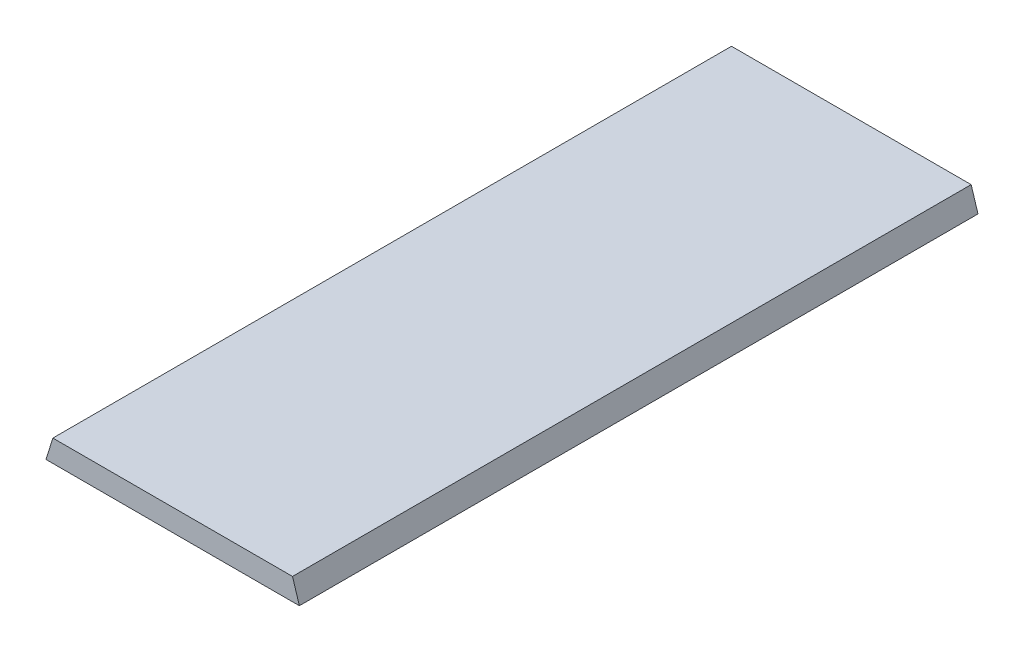
ISO-10303-21;
HEADER;
FILE_DESCRIPTION(('STEP AP214'),'2;1');
FILE_NAME('part.step','',(''),(''),'','','');
FILE_SCHEMA(('AUTOMOTIVE_DESIGN { 1 0 10303 214 1 1 1 1 }'));
ENDSEC;
DATA;
#1=APPLICATION_CONTEXT('core data for automotive mechanical design processes');
#2=APPLICATION_PROTOCOL_DEFINITION('international standard','automotive_design',2000,#1);
#3=PRODUCT_CONTEXT('',#1,'mechanical');
#4=PRODUCT('Part','Part','',(#3));
#5=PRODUCT_RELATED_PRODUCT_CATEGORY('part','',(#4));
#6=PRODUCT_DEFINITION_FORMATION('','',#4);
#7=PRODUCT_DEFINITION_CONTEXT('part definition',#1,'design');
#8=PRODUCT_DEFINITION('design','',#6,#7);
#9=PRODUCT_DEFINITION_SHAPE('','',#8);
#10=(LENGTH_UNIT() NAMED_UNIT(*) SI_UNIT(.MILLI.,.METRE.));
#11=(NAMED_UNIT(*) PLANE_ANGLE_UNIT() SI_UNIT($,.RADIAN.));
#12=(NAMED_UNIT(*) SI_UNIT($,.STERADIAN.) SOLID_ANGLE_UNIT());
#13=UNCERTAINTY_MEASURE_WITH_UNIT(LENGTH_MEASURE(1.E-05),#10,'distance_accuracy_value','');
#14=(GEOMETRIC_REPRESENTATION_CONTEXT(3) GLOBAL_UNCERTAINTY_ASSIGNED_CONTEXT((#13)) GLOBAL_UNIT_ASSIGNED_CONTEXT((#10,
#11,#12)) REPRESENTATION_CONTEXT('',''));
#15=CARTESIAN_POINT('',(0.,0.,0.));
#16=DIRECTION('',(0.,0.,1.));
#17=DIRECTION('',(1.,0.,0.));
#18=AXIS2_PLACEMENT_3D('',#15,#16,#17);
#19=CARTESIAN_POINT('',(-9.79999999999998,0.,-52.5));
#20=DIRECTION('',(0.954688534302194,-0.297606791710014,0.));
#21=DIRECTION('',(0.297606791710014,0.954688534302195,0.));
#22=AXIS2_PLACEMENT_3D('',#19,#20,#21);
#23=PLANE('',#22);
#24=DIRECTION('',(0.297606791710014,0.954688534302194,0.));
#25=VECTOR('',#24,1.);
#26=CARTESIAN_POINT('',(-9.79999999999998,0.,0.));
#27=LINE('',#26,#25);
#28=CARTESIAN_POINT('',(-9.79999999999998,0.,0.));
#29=VERTEX_POINT('',#28);
#30=CARTESIAN_POINT('',(-9.27005591066738,1.70000000000007,0.));
#31=VERTEX_POINT('',#30);
#32=EDGE_CURVE('E113',#29,#31,#27,.T.);
#33=ORIENTED_EDGE('',*,*,#32,.T.);
#34=DIRECTION('',(0.,0.,1.));
#35=VECTOR('',#34,1.);
#36=CARTESIAN_POINT('',(-9.27005591066738,1.70000000000007,-52.5));
#37=LINE('',#36,#35);
#38=CARTESIAN_POINT('',(-9.27005591066738,1.70000000000007,-52.5));
#39=VERTEX_POINT('',#38);
#40=EDGE_CURVE('E11',#39,#31,#37,.T.);
#41=ORIENTED_EDGE('',*,*,#40,.F.);
#42=DIRECTION('',(0.297606791710014,0.954688534302194,0.));
#43=VECTOR('',#42,1.);
#44=CARTESIAN_POINT('',(-9.79999999999998,0.,-52.5));
#45=LINE('',#44,#43);
#46=CARTESIAN_POINT('',(-9.79999999999998,0.,-52.5));
#47=VERTEX_POINT('',#46);
#48=EDGE_CURVE('E95',#47,#39,#45,.T.);
#49=ORIENTED_EDGE('',*,*,#48,.F.);
#50=DIRECTION('',(0.,0.,1.));
#51=VECTOR('',#50,1.);
#52=CARTESIAN_POINT('',(-9.79999999999998,0.,-52.5));
#53=LINE('',#52,#51);
#54=EDGE_CURVE('E62',#47,#29,#53,.T.);
#55=ORIENTED_EDGE('',*,*,#54,.T.);
#56=EDGE_LOOP('',(#33,#41,#49,#55));
#57=FACE_BOUND('',#56,.T.);
#58=ADVANCED_FACE('F45',(#57),#23,.F.);
#59=CARTESIAN_POINT('',(-9.27005591066738,1.70000000000007,-52.5));
#60=DIRECTION('',(0.,-1.,0.));
#61=DIRECTION('',(1.,0.,0.));
#62=AXIS2_PLACEMENT_3D('',#59,#60,#61);
#63=PLANE('',#62);
#64=DIRECTION('',(1.,0.,0.));
#65=VECTOR('',#64,1.);
#66=CARTESIAN_POINT('',(-9.27005591066738,1.70000000000007,0.));
#67=LINE('',#66,#65);
#68=CARTESIAN_POINT('',(9.27005591066739,1.69999999999999,0.));
#69=VERTEX_POINT('',#68);
#70=EDGE_CURVE('E101',#31,#69,#67,.T.);
#71=ORIENTED_EDGE('',*,*,#70,.T.);
#72=DIRECTION('',(0.,0.,1.));
#73=VECTOR('',#72,1.);
#74=CARTESIAN_POINT('',(9.27005591066739,1.69999999999999,-52.5));
#75=LINE('',#74,#73);
#76=CARTESIAN_POINT('',(9.27005591066739,1.69999999999999,-52.5));
#77=VERTEX_POINT('',#76);
#78=EDGE_CURVE('E54',#77,#69,#75,.T.);
#79=ORIENTED_EDGE('',*,*,#78,.F.);
#80=DIRECTION('',(1.,0.,0.));
#81=VECTOR('',#80,1.);
#82=CARTESIAN_POINT('',(-9.27005591066738,1.70000000000007,-52.5));
#83=LINE('',#82,#81);
#84=EDGE_CURVE('E88',#39,#77,#83,.T.);
#85=ORIENTED_EDGE('',*,*,#84,.F.);
#86=ORIENTED_EDGE('',*,*,#40,.T.);
#87=EDGE_LOOP('',(#71,#79,#85,#86));
#88=FACE_BOUND('',#87,.T.);
#89=ADVANCED_FACE('F100',(#88),#63,.F.);
#90=CARTESIAN_POINT('',(9.27005591066739,1.69999999999999,-52.5));
#91=DIRECTION('',(-0.954688534302194,-0.297606791710015,0.));
#92=DIRECTION('',(0.297606791710015,-0.954688534302194,0.));
#93=AXIS2_PLACEMENT_3D('',#90,#91,#92);
#94=PLANE('',#93);
#95=DIRECTION('',(0.297606791710015,-0.954688534302194,0.));
#96=VECTOR('',#95,1.);
#97=CARTESIAN_POINT('',(9.27005591066739,1.69999999999999,0.));
#98=LINE('',#97,#96);
#99=CARTESIAN_POINT('',(9.79999999999997,0.,0.));
#100=VERTEX_POINT('',#99);
#101=EDGE_CURVE('E118',#69,#100,#98,.T.);
#102=ORIENTED_EDGE('',*,*,#101,.T.);
#103=DIRECTION('',(0.,0.,1.));
#104=VECTOR('',#103,1.);
#105=CARTESIAN_POINT('',(9.79999999999997,0.,-52.5));
#106=LINE('',#105,#104);
#107=CARTESIAN_POINT('',(9.79999999999997,0.,-52.5));
#108=VERTEX_POINT('',#107);
#109=EDGE_CURVE('E77',#108,#100,#106,.T.);
#110=ORIENTED_EDGE('',*,*,#109,.F.);
#111=DIRECTION('',(0.297606791710015,-0.954688534302194,0.));
#112=VECTOR('',#111,1.);
#113=CARTESIAN_POINT('',(9.27005591066739,1.69999999999999,-52.5));
#114=LINE('',#113,#112);
#115=EDGE_CURVE('E94',#77,#108,#114,.T.);
#116=ORIENTED_EDGE('',*,*,#115,.F.);
#117=ORIENTED_EDGE('',*,*,#78,.T.);
#118=EDGE_LOOP('',(#102,#110,#116,#117));
#119=FACE_BOUND('',#118,.T.);
#120=ADVANCED_FACE('F105',(#119),#94,.F.);
#121=CARTESIAN_POINT('',(-9.79999999999998,0.,-52.5));
#122=DIRECTION('',(0.,-1.,0.));
#123=DIRECTION('',(1.,0.,0.));
#124=AXIS2_PLACEMENT_3D('',#121,#122,#123);
#125=PLANE('',#124);
#126=DIRECTION('',(1.,0.,0.));
#127=VECTOR('',#126,1.);
#128=CARTESIAN_POINT('',(-9.79999999999998,0.,0.));
#129=LINE('',#128,#127);
#130=EDGE_CURVE('E121',#29,#100,#129,.T.);
#131=ORIENTED_EDGE('',*,*,#130,.F.);
#132=ORIENTED_EDGE('',*,*,#54,.F.);
#133=DIRECTION('',(1.,0.,0.));
#134=VECTOR('',#133,1.);
#135=CARTESIAN_POINT('',(-9.79999999999998,0.,-52.5));
#136=LINE('',#135,#134);
#137=EDGE_CURVE('E107',#47,#108,#136,.T.);
#138=ORIENTED_EDGE('',*,*,#137,.T.);
#139=ORIENTED_EDGE('',*,*,#109,.T.);
#140=EDGE_LOOP('',(#131,#132,#138,#139));
#141=FACE_BOUND('',#140,.T.);
#142=ADVANCED_FACE('F131',(#141),#125,.T.);
#143=CARTESIAN_POINT('',(0.,0.,-52.5));
#144=DIRECTION('',(0.,0.,-1.));
#145=DIRECTION('',(-1.,0.,0.));
#146=AXIS2_PLACEMENT_3D('',#143,#144,#145);
#147=PLANE('',#146);
#148=ORIENTED_EDGE('',*,*,#48,.T.);
#149=ORIENTED_EDGE('',*,*,#84,.T.);
#150=ORIENTED_EDGE('',*,*,#115,.T.);
#151=ORIENTED_EDGE('',*,*,#137,.F.);
#152=EDGE_LOOP('',(#148,#149,#150,#151));
#153=FACE_BOUND('',#152,.T.);
#154=ADVANCED_FACE('F91',(#153),#147,.T.);
#155=CARTESIAN_POINT('',(0.,0.,0.));
#156=DIRECTION('',(0.,0.,-1.));
#157=DIRECTION('',(-1.,0.,0.));
#158=AXIS2_PLACEMENT_3D('',#155,#156,#157);
#159=PLANE('',#158);
#160=ORIENTED_EDGE('',*,*,#32,.F.);
#161=ORIENTED_EDGE('',*,*,#130,.T.);
#162=ORIENTED_EDGE('',*,*,#101,.F.);
#163=ORIENTED_EDGE('',*,*,#70,.F.);
#164=EDGE_LOOP('',(#160,#161,#162,#163));
#165=FACE_BOUND('',#164,.T.);
#166=ADVANCED_FACE('F130',(#165),#159,.F.);
#167=CLOSED_SHELL('',(#58,#89,#120,#142,#154,#166));
#168=MANIFOLD_SOLID_BREP('B2',#167);
#169=ADVANCED_BREP_SHAPE_REPRESENTATION('',(#18,#168),#14);
#170=SHAPE_DEFINITION_REPRESENTATION(#9,#169);
ENDSEC;
END-ISO-10303-21;
